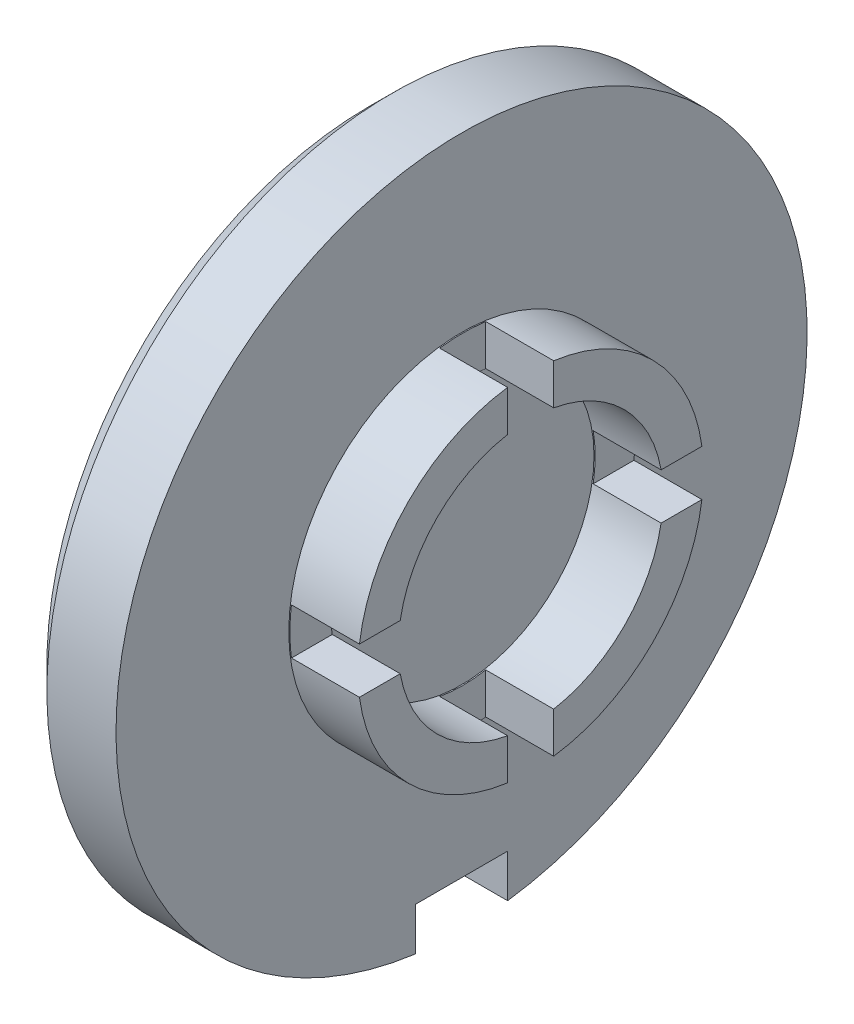
ISO-10303-21;
HEADER;
FILE_DESCRIPTION(('STEP AP214'),'2;1');
FILE_NAME('part.step','',(''),(''),'','','');
FILE_SCHEMA(('AUTOMOTIVE_DESIGN { 1 0 10303 214 1 1 1 1 }'));
ENDSEC;
DATA;
#1=APPLICATION_CONTEXT('core data for automotive mechanical design processes');
#2=APPLICATION_PROTOCOL_DEFINITION('international standard','automotive_design',2000,#1);
#3=PRODUCT_CONTEXT('',#1,'mechanical');
#4=PRODUCT('Part','Part','',(#3));
#5=PRODUCT_RELATED_PRODUCT_CATEGORY('part','',(#4));
#6=PRODUCT_DEFINITION_FORMATION('','',#4);
#7=PRODUCT_DEFINITION_CONTEXT('part definition',#1,'design');
#8=PRODUCT_DEFINITION('design','',#6,#7);
#9=PRODUCT_DEFINITION_SHAPE('','',#8);
#10=(LENGTH_UNIT() NAMED_UNIT(*) SI_UNIT(.MILLI.,.METRE.));
#11=(NAMED_UNIT(*) PLANE_ANGLE_UNIT() SI_UNIT($,.RADIAN.));
#12=(NAMED_UNIT(*) SI_UNIT($,.STERADIAN.) SOLID_ANGLE_UNIT());
#13=UNCERTAINTY_MEASURE_WITH_UNIT(LENGTH_MEASURE(1.E-05),#10,'distance_accuracy_value','');
#14=(GEOMETRIC_REPRESENTATION_CONTEXT(3) GLOBAL_UNCERTAINTY_ASSIGNED_CONTEXT((#13)) GLOBAL_UNIT_ASSIGNED_CONTEXT((#10,
#11,#12)) REPRESENTATION_CONTEXT('',''));
#15=CARTESIAN_POINT('',(0.,0.,0.));
#16=DIRECTION('',(0.,0.,1.));
#17=DIRECTION('',(1.,0.,0.));
#18=AXIS2_PLACEMENT_3D('',#15,#16,#17);
#19=CARTESIAN_POINT('',(-61.,18.,66.));
#20=DIRECTION('',(1.,0.,0.));
#21=DIRECTION('',(0.,0.,-1.));
#22=AXIS2_PLACEMENT_3D('',#19,#20,#21);
#23=PLANE('',#22);
#24=DIRECTION('',(0.,1.,0.));
#25=VECTOR('',#24,1.);
#26=CARTESIAN_POINT('',(-61.,18.,66.8));
#27=LINE('',#26,#25);
#28=CARTESIAN_POINT('',(-61.,12.4574374157796,66.8));
#29=VERTEX_POINT('',#28);
#30=CARTESIAN_POINT('',(-61.,12.8,66.8));
#31=VERTEX_POINT('',#30);
#32=EDGE_CURVE('E359',#29,#31,#27,.T.);
#33=ORIENTED_EDGE('',*,*,#32,.F.);
#34=CARTESIAN_POINT('',(-61.,18.,66.));
#35=DIRECTION('',(-1.,0.,0.));
#36=DIRECTION('',(0.,0.,1.));
#37=AXIS2_PLACEMENT_3D('',#34,#35,#36);
#38=CIRCLE('',#37,5.6);
#39=CARTESIAN_POINT('',(-61.,12.4574374157796,65.2));
#40=VERTEX_POINT('',#39);
#41=EDGE_CURVE('E260',#29,#40,#38,.T.);
#42=ORIENTED_EDGE('',*,*,#41,.T.);
#43=DIRECTION('',(0.,1.,0.));
#44=VECTOR('',#43,1.);
#45=CARTESIAN_POINT('',(-61.,18.,65.2));
#46=LINE('',#45,#44);
#47=CARTESIAN_POINT('',(-61.,12.8,65.2));
#48=VERTEX_POINT('',#47);
#49=EDGE_CURVE('E395',#40,#48,#46,.T.);
#50=ORIENTED_EDGE('',*,*,#49,.T.);
#51=DIRECTION('',(0.,0.,-1.));
#52=VECTOR('',#51,1.);
#53=CARTESIAN_POINT('',(-61.,12.8,66.));
#54=LINE('',#53,#52);
#55=EDGE_CURVE('E205',#31,#48,#54,.T.);
#56=ORIENTED_EDGE('',*,*,#55,.F.);
#57=EDGE_LOOP('',(#33,#42,#50,#56));
#58=FACE_BOUND('',#57,.T.);
#59=ADVANCED_FACE('F47',(#58),#23,.F.);
#60=CARTESIAN_POINT('',(-60.6,18.,66.));
#61=DIRECTION('',(1.,0.,0.));
#62=DIRECTION('',(0.,0.,-1.));
#63=AXIS2_PLACEMENT_3D('',#60,#61,#62);
#64=CONICAL_SURFACE('',#63,6.,0.785398163397448);
#65=CARTESIAN_POINT('',(-59.7053728090001,11.151943041791,66.8));
#66=CARTESIAN_POINT('',(-59.8881030317565,11.3359192533132,66.8));
#67=CARTESIAN_POINT('',(-60.0707866928955,11.5199417495671,66.8));
#68=CARTESIAN_POINT('',(-60.4360245862569,11.8881147982359,66.8));
#69=CARTESIAN_POINT('',(-60.6185788185969,12.0722653505341,66.8));
#70=CARTESIAN_POINT('',(-60.9835219670776,12.4407304192213,66.8));
#71=CARTESIAN_POINT('',(-61.1659108831408,12.625044935687,66.8));
#72=CARTESIAN_POINT('',(-61.5304582431577,12.9939020574378,66.8));
#73=CARTESIAN_POINT('',(-61.7126166868986,13.1784446629332,66.8));
#74=CARTESIAN_POINT('',(-61.8946271909999,13.3631332484449,66.8));
#75=B_SPLINE_CURVE_WITH_KNOTS('',3,(#65,#66,#67,#68,#69,#70,#71,#72,#73,#74),.UNSPECIFIED.,.F.,
.F.,(4,2,2,2,4),(0.,0.777906337908816,1.55581196755151,2.33371796179649,3.11162467374071),.UNSPECIFIED.);
#76=CARTESIAN_POINT('',(-60.6,12.0535725010726,66.8));
#77=VERTEX_POINT('',#76);
#78=EDGE_CURVE('E362',#77,#29,#75,.T.);
#79=ORIENTED_EDGE('',*,*,#78,.F.);
#80=CARTESIAN_POINT('',(-60.6,18.,66.));
#81=DIRECTION('',(-1.,0.,0.));
#82=DIRECTION('',(0.,0.,1.));
#83=AXIS2_PLACEMENT_3D('',#80,#81,#82);
#84=CIRCLE('',#83,6.);
#85=CARTESIAN_POINT('',(-60.6,12.0535725010726,65.2));
#86=VERTEX_POINT('',#85);
#87=EDGE_CURVE('E264',#77,#86,#84,.T.);
#88=ORIENTED_EDGE('',*,*,#87,.T.);
#89=CARTESIAN_POINT('',(-59.7053728090001,11.151943041791,65.2));
#90=CARTESIAN_POINT('',(-59.8881030317565,11.3359192533132,65.2));
#91=CARTESIAN_POINT('',(-60.0707866928955,11.5199417495671,65.2));
#92=CARTESIAN_POINT('',(-60.4360245862569,11.8881147982359,65.2));
#93=CARTESIAN_POINT('',(-60.6185788185969,12.0722653505341,65.2));
#94=CARTESIAN_POINT('',(-60.9835219670776,12.4407304192213,65.2));
#95=CARTESIAN_POINT('',(-61.1659108831408,12.625044935687,65.2));
#96=CARTESIAN_POINT('',(-61.5304582431577,12.9939020574378,65.2));
#97=CARTESIAN_POINT('',(-61.7126166868986,13.1784446629332,65.2));
#98=CARTESIAN_POINT('',(-61.8946271909999,13.3631332484449,65.2));
#99=B_SPLINE_CURVE_WITH_KNOTS('',3,(#89,#90,#91,#92,#93,#94,#95,#96,#97,#98),.UNSPECIFIED.,.F.,
.F.,(4,2,2,2,4),(0.,0.777906337908816,1.55581196755151,2.33371796179649,3.11162467374071),.UNSPECIFIED.);
#100=EDGE_CURVE('E387',#86,#40,#99,.T.);
#101=ORIENTED_EDGE('',*,*,#100,.T.);
#102=ORIENTED_EDGE('',*,*,#41,.F.);
#103=EDGE_LOOP('',(#79,#88,#101,#102));
#104=FACE_BOUND('',#103,.T.);
#105=ADVANCED_FACE('F373',(#104),#64,.T.);
#106=CARTESIAN_POINT('',(-66.,18.,66.));
#107=DIRECTION('',(-1.,0.,0.));
#108=DIRECTION('',(0.,0.,1.));
#109=AXIS2_PLACEMENT_3D('',#106,#107,#108);
#110=CYLINDRICAL_SURFACE('',#109,6.);
#111=DIRECTION('',(-1.,0.,0.));
#112=VECTOR('',#111,1.);
#113=CARTESIAN_POINT('',(-66.,12.0535725010726,66.8));
#114=LINE('',#113,#112);
#115=CARTESIAN_POINT('',(-59.4,12.0535725010726,66.8));
#116=VERTEX_POINT('',#115);
#117=EDGE_CURVE('E371',#116,#77,#114,.T.);
#118=ORIENTED_EDGE('',*,*,#117,.F.);
#119=CARTESIAN_POINT('',(-59.4,18.,66.));
#120=DIRECTION('',(-1.,0.,0.));
#121=DIRECTION('',(0.,0.,1.));
#122=AXIS2_PLACEMENT_3D('',#119,#120,#121);
#123=CIRCLE('',#122,6.);
#124=CARTESIAN_POINT('',(-59.4,12.0535725010726,65.2));
#125=VERTEX_POINT('',#124);
#126=EDGE_CURVE('E268',#116,#125,#123,.T.);
#127=ORIENTED_EDGE('',*,*,#126,.T.);
#128=DIRECTION('',(-1.,0.,0.));
#129=VECTOR('',#128,1.);
#130=CARTESIAN_POINT('',(-66.,12.0535725010726,65.2));
#131=LINE('',#130,#129);
#132=EDGE_CURVE('E63',#125,#86,#131,.T.);
#133=ORIENTED_EDGE('',*,*,#132,.T.);
#134=ORIENTED_EDGE('',*,*,#87,.F.);
#135=EDGE_LOOP('',(#118,#127,#133,#134));
#136=FACE_BOUND('',#135,.T.);
#137=ADVANCED_FACE('F406',(#136),#110,.T.);
#138=CARTESIAN_POINT('',(-59.4,24.,66.));
#139=DIRECTION('',(-1.,0.,0.));
#140=DIRECTION('',(0.,0.,1.));
#141=AXIS2_PLACEMENT_3D('',#138,#139,#140);
#142=PLANE('',#141);
#143=CARTESIAN_POINT('',(-59.4,18.,66.));
#144=DIRECTION('',(-1.,0.,0.));
#145=DIRECTION('',(0.,0.,1.));
#146=AXIS2_PLACEMENT_3D('',#143,#144,#145);
#147=CIRCLE('',#146,3.);
#148=CARTESIAN_POINT('',(-59.4,18.,69.));
#149=VERTEX_POINT('',#148);
#150=EDGE_CURVE('E271',#149,#149,#147,.T.);
#151=ORIENTED_EDGE('',*,*,#150,.T.);
#152=EDGE_LOOP('',(#151));
#153=FACE_BOUND('',#152,.T.);
#154=DIRECTION('',(0.,-1.,0.));
#155=VECTOR('',#154,1.);
#156=CARTESIAN_POINT('',(-59.4,24.,66.8));
#157=LINE('',#156,#155);
#158=CARTESIAN_POINT('',(-59.4,12.8,66.8));
#159=VERTEX_POINT('',#158);
#160=EDGE_CURVE('E11',#159,#116,#157,.T.);
#161=ORIENTED_EDGE('',*,*,#160,.F.);
#162=DIRECTION('',(0.,0.,1.));
#163=VECTOR('',#162,1.);
#164=CARTESIAN_POINT('',(-59.4,12.8,66.));
#165=LINE('',#164,#163);
#166=CARTESIAN_POINT('',(-59.4,12.8,65.2));
#167=VERTEX_POINT('',#166);
#168=EDGE_CURVE('E56',#167,#159,#165,.T.);
#169=ORIENTED_EDGE('',*,*,#168,.F.);
#170=DIRECTION('',(0.,-1.,0.));
#171=VECTOR('',#170,1.);
#172=CARTESIAN_POINT('',(-59.4,24.,65.2));
#173=LINE('',#172,#171);
#174=EDGE_CURVE('E188',#167,#125,#173,.T.);
#175=ORIENTED_EDGE('',*,*,#174,.T.);
#176=ORIENTED_EDGE('',*,*,#126,.F.);
#177=EDGE_LOOP('',(#161,#169,#175,#176));
#178=FACE_BOUND('',#177,.T.);
#179=ADVANCED_FACE('F210',(#153,#178),#142,.F.);
#180=CARTESIAN_POINT('',(-58.2,21.,66.));
#181=DIRECTION('',(-1.,0.,0.));
#182=DIRECTION('',(0.,0.,1.));
#183=AXIS2_PLACEMENT_3D('',#180,#181,#182);
#184=PLANE('',#183);
#185=DIRECTION('',(0.,-1.,0.));
#186=VECTOR('',#185,1.);
#187=CARTESIAN_POINT('',(-58.2,21.,66.4));
#188=LINE('',#187,#186);
#189=CARTESIAN_POINT('',(-58.2,15.7350496694188,66.4));
#190=VERTEX_POINT('',#189);
#191=CARTESIAN_POINT('',(-58.2,15.0267862505363,66.4));
#192=VERTEX_POINT('',#191);
#193=EDGE_CURVE('E324',#190,#192,#188,.T.);
#194=ORIENTED_EDGE('',*,*,#193,.F.);
#195=CARTESIAN_POINT('',(-58.2,18.,66.));
#196=DIRECTION('',(-1.,0.,0.));
#197=DIRECTION('',(0.,0.,1.));
#198=AXIS2_PLACEMENT_3D('',#195,#196,#197);
#199=CIRCLE('',#198,2.3);
#200=CARTESIAN_POINT('',(-58.2,17.6,68.2649503305812));
#201=VERTEX_POINT('',#200);
#202=EDGE_CURVE('E259',#190,#201,#199,.T.);
#203=ORIENTED_EDGE('',*,*,#202,.T.);
#204=DIRECTION('',(0.,0.,-1.));
#205=VECTOR('',#204,1.);
#206=CARTESIAN_POINT('',(-58.2,17.6,66.));
#207=LINE('',#206,#205);
#208=CARTESIAN_POINT('',(-58.2,17.6,68.9732137494637));
#209=VERTEX_POINT('',#208);
#210=EDGE_CURVE('E293',#209,#201,#207,.T.);
#211=ORIENTED_EDGE('',*,*,#210,.F.);
#212=CARTESIAN_POINT('',(-58.2,18.,66.));
#213=DIRECTION('',(-1.,0.,0.));
#214=DIRECTION('',(0.,0.,1.));
#215=AXIS2_PLACEMENT_3D('',#212,#213,#214);
#216=CIRCLE('',#215,3.);
#217=EDGE_CURVE('E280',#192,#209,#216,.T.);
#218=ORIENTED_EDGE('',*,*,#217,.F.);
#219=EDGE_LOOP('',(#194,#203,#211,#218));
#220=FACE_BOUND('',#219,.T.);
#221=ADVANCED_FACE('F431',(#220),#184,.F.);
#222=DIRECTION('',(0.,-1.,0.));
#223=VECTOR('',#222,1.);
#224=CARTESIAN_POINT('',(-58.2,21.,66.4));
#225=LINE('',#224,#223);
#226=CARTESIAN_POINT('',(-58.2,20.9732137494637,66.4));
#227=VERTEX_POINT('',#226);
#228=CARTESIAN_POINT('',(-58.2,20.2649503305812,66.4));
#229=VERTEX_POINT('',#228);
#230=EDGE_CURVE('E330',#227,#229,#225,.T.);
#231=ORIENTED_EDGE('',*,*,#230,.F.);
#232=CARTESIAN_POINT('',(-58.2,18.4,68.9732137494637));
#233=VERTEX_POINT('',#232);
#234=EDGE_CURVE('E275',#233,#227,#216,.T.);
#235=ORIENTED_EDGE('',*,*,#234,.F.);
#236=DIRECTION('',(0.,0.,1.));
#237=VECTOR('',#236,1.);
#238=CARTESIAN_POINT('',(-58.2,18.4,66.));
#239=LINE('',#238,#237);
#240=CARTESIAN_POINT('',(-58.2,18.4,68.2649503305812));
#241=VERTEX_POINT('',#240);
#242=EDGE_CURVE('E300',#241,#233,#239,.T.);
#243=ORIENTED_EDGE('',*,*,#242,.F.);
#244=EDGE_CURVE('E249',#241,#229,#199,.T.);
#245=ORIENTED_EDGE('',*,*,#244,.T.);
#246=EDGE_LOOP('',(#231,#235,#243,#245));
#247=FACE_BOUND('',#246,.T.);
#248=ADVANCED_FACE('F423',(#247),#184,.F.);
#249=CARTESIAN_POINT('',(-66.,18.,66.));
#250=DIRECTION('',(-1.,0.,0.));
#251=DIRECTION('',(0.,0.,1.));
#252=AXIS2_PLACEMENT_3D('',#249,#250,#251);
#253=CYLINDRICAL_SURFACE('',#252,2.3);
#254=CARTESIAN_POINT('',(-59.4,18.,66.));
#255=DIRECTION('',(-1.,0.,0.));
#256=DIRECTION('',(0.,0.,1.));
#257=AXIS2_PLACEMENT_3D('',#254,#255,#256);
#258=CIRCLE('',#257,2.3);
#259=CARTESIAN_POINT('',(-59.4,18.,68.3));
#260=VERTEX_POINT('',#259);
#261=EDGE_CURVE('E255',#260,#260,#258,.T.);
#262=ORIENTED_EDGE('',*,*,#261,.T.);
#263=EDGE_LOOP('',(#262));
#264=FACE_BOUND('',#263,.T.);
#265=DIRECTION('',(-1.,0.,0.));
#266=VECTOR('',#265,1.);
#267=CARTESIAN_POINT('',(-66.,15.7350496694188,66.4));
#268=LINE('',#267,#266);
#269=CARTESIAN_POINT('',(-59.38,15.7350496694188,66.4));
#270=VERTEX_POINT('',#269);
#271=EDGE_CURVE('E321',#270,#190,#268,.F.);
#272=ORIENTED_EDGE('',*,*,#271,.F.);
#273=CARTESIAN_POINT('',(-59.38,18.,66.));
#274=DIRECTION('',(1.,0.,0.));
#275=DIRECTION('',(0.,0.,-1.));
#276=AXIS2_PLACEMENT_3D('',#273,#274,#275);
#277=CIRCLE('',#276,2.3);
#278=CARTESIAN_POINT('',(-59.38,15.7350496694188,65.6));
#279=VERTEX_POINT('',#278);
#280=EDGE_CURVE('E317',#279,#270,#277,.F.);
#281=ORIENTED_EDGE('',*,*,#280,.F.);
#282=DIRECTION('',(-1.,0.,0.));
#283=VECTOR('',#282,1.);
#284=CARTESIAN_POINT('',(-66.,15.7350496694188,65.6));
#285=LINE('',#284,#283);
#286=CARTESIAN_POINT('',(-58.2,15.7350496694188,65.6));
#287=VERTEX_POINT('',#286);
#288=EDGE_CURVE('E333',#279,#287,#285,.F.);
#289=ORIENTED_EDGE('',*,*,#288,.T.);
#290=CARTESIAN_POINT('',(-58.2,17.6,63.7350496694188));
#291=VERTEX_POINT('',#290);
#292=EDGE_CURVE('E254',#291,#287,#199,.T.);
#293=ORIENTED_EDGE('',*,*,#292,.F.);
#294=DIRECTION('',(-1.,0.,0.));
#295=VECTOR('',#294,1.);
#296=CARTESIAN_POINT('',(-66.,17.6,63.7350496694188));
#297=LINE('',#296,#295);
#298=CARTESIAN_POINT('',(-59.38,17.6,63.7350496694188));
#299=VERTEX_POINT('',#298);
#300=EDGE_CURVE('E286',#299,#291,#297,.F.);
#301=ORIENTED_EDGE('',*,*,#300,.F.);
#302=CARTESIAN_POINT('',(-59.38,18.,66.));
#303=DIRECTION('',(1.,0.,0.));
#304=DIRECTION('',(0.,0.,-1.));
#305=AXIS2_PLACEMENT_3D('',#302,#303,#304);
#306=CIRCLE('',#305,2.3);
#307=CARTESIAN_POINT('',(-59.38,18.4,63.7350496694188));
#308=VERTEX_POINT('',#307);
#309=EDGE_CURVE('E282',#308,#299,#306,.F.);
#310=ORIENTED_EDGE('',*,*,#309,.F.);
#311=DIRECTION('',(-1.,0.,0.));
#312=VECTOR('',#311,1.);
#313=CARTESIAN_POINT('',(-66.,18.4,63.7350496694188));
#314=LINE('',#313,#312);
#315=CARTESIAN_POINT('',(-58.2,18.4,63.7350496694188));
#316=VERTEX_POINT('',#315);
#317=EDGE_CURVE('E301',#316,#308,#314,.T.);
#318=ORIENTED_EDGE('',*,*,#317,.F.);
#319=CARTESIAN_POINT('',(-58.2,20.2649503305812,65.6));
#320=VERTEX_POINT('',#319);
#321=EDGE_CURVE('E253',#320,#316,#199,.T.);
#322=ORIENTED_EDGE('',*,*,#321,.F.);
#323=DIRECTION('',(-1.,0.,0.));
#324=VECTOR('',#323,1.);
#325=CARTESIAN_POINT('',(-66.,20.2649503305812,65.6));
#326=LINE('',#325,#324);
#327=CARTESIAN_POINT('',(-59.38,20.2649503305812,65.6));
#328=VERTEX_POINT('',#327);
#329=EDGE_CURVE('E341',#320,#328,#326,.T.);
#330=ORIENTED_EDGE('',*,*,#329,.T.);
#331=CARTESIAN_POINT('',(-59.38,20.2649503305812,66.4));
#332=VERTEX_POINT('',#331);
#333=EDGE_CURVE('E318',#332,#328,#277,.F.);
#334=ORIENTED_EDGE('',*,*,#333,.F.);
#335=DIRECTION('',(-1.,0.,0.));
#336=VECTOR('',#335,1.);
#337=CARTESIAN_POINT('',(-66.,20.2649503305812,66.4));
#338=LINE('',#337,#336);
#339=EDGE_CURVE('E327',#229,#332,#338,.T.);
#340=ORIENTED_EDGE('',*,*,#339,.F.);
#341=ORIENTED_EDGE('',*,*,#244,.F.);
#342=DIRECTION('',(-1.,0.,0.));
#343=VECTOR('',#342,1.);
#344=CARTESIAN_POINT('',(-66.,18.4,68.2649503305812));
#345=LINE('',#344,#343);
#346=CARTESIAN_POINT('',(-59.38,18.4,68.2649503305812));
#347=VERTEX_POINT('',#346);
#348=EDGE_CURVE('E297',#347,#241,#345,.F.);
#349=ORIENTED_EDGE('',*,*,#348,.F.);
#350=CARTESIAN_POINT('',(-59.38,17.6,68.2649503305812));
#351=VERTEX_POINT('',#350);
#352=EDGE_CURVE('E285',#351,#347,#306,.F.);
#353=ORIENTED_EDGE('',*,*,#352,.F.);
#354=DIRECTION('',(-1.,0.,0.));
#355=VECTOR('',#354,1.);
#356=CARTESIAN_POINT('',(-66.,17.6,68.2649503305812));
#357=LINE('',#356,#355);
#358=EDGE_CURVE('E290',#201,#351,#357,.T.);
#359=ORIENTED_EDGE('',*,*,#358,.F.);
#360=ORIENTED_EDGE('',*,*,#202,.F.);
#361=EDGE_LOOP('',(#272,#281,#289,#293,#301,#310,#318,#322,#330,#334,#340,#341,#349,#353,#359,#360));
#362=FACE_BOUND('',#361,.T.);
#363=ADVANCED_FACE('F420',(#264,#362),#253,.F.);
#364=CARTESIAN_POINT('',(-66.,18.,66.));
#365=DIRECTION('',(-1.,0.,0.));
#366=DIRECTION('',(0.,0.,1.));
#367=AXIS2_PLACEMENT_3D('',#364,#365,#366);
#368=CYLINDRICAL_SURFACE('',#367,3.);
#369=ORIENTED_EDGE('',*,*,#150,.F.);
#370=EDGE_LOOP('',(#369));
#371=FACE_BOUND('',#370,.T.);
#372=DIRECTION('',(-1.,0.,0.));
#373=VECTOR('',#372,1.);
#374=CARTESIAN_POINT('',(-66.,15.0267862505363,66.4));
#375=LINE('',#374,#373);
#376=CARTESIAN_POINT('',(-59.38,15.0267862505363,66.4));
#377=VERTEX_POINT('',#376);
#378=EDGE_CURVE('E198',#192,#377,#375,.T.);
#379=ORIENTED_EDGE('',*,*,#378,.F.);
#380=ORIENTED_EDGE('',*,*,#217,.T.);
#381=DIRECTION('',(-1.,0.,0.));
#382=VECTOR('',#381,1.);
#383=CARTESIAN_POINT('',(-66.,17.6,68.9732137494637));
#384=LINE('',#383,#382);
#385=CARTESIAN_POINT('',(-59.38,17.6,68.9732137494637));
#386=VERTEX_POINT('',#385);
#387=EDGE_CURVE('E230',#386,#209,#384,.F.);
#388=ORIENTED_EDGE('',*,*,#387,.F.);
#389=CARTESIAN_POINT('',(-59.38,18.,66.));
#390=DIRECTION('',(1.,0.,0.));
#391=DIRECTION('',(0.,0.,-1.));
#392=AXIS2_PLACEMENT_3D('',#389,#390,#391);
#393=CIRCLE('',#392,3.);
#394=CARTESIAN_POINT('',(-59.38,18.4,68.9732137494637));
#395=VERTEX_POINT('',#394);
#396=EDGE_CURVE('E234',#395,#386,#393,.T.);
#397=ORIENTED_EDGE('',*,*,#396,.F.);
#398=DIRECTION('',(-1.,0.,0.));
#399=VECTOR('',#398,1.);
#400=CARTESIAN_POINT('',(-66.,18.4,68.9732137494637));
#401=LINE('',#400,#399);
#402=EDGE_CURVE('E235',#233,#395,#401,.T.);
#403=ORIENTED_EDGE('',*,*,#402,.F.);
#404=ORIENTED_EDGE('',*,*,#234,.T.);
#405=DIRECTION('',(-1.,0.,0.));
#406=VECTOR('',#405,1.);
#407=CARTESIAN_POINT('',(-66.,20.9732137494637,66.4));
#408=LINE('',#407,#406);
#409=CARTESIAN_POINT('',(-59.38,20.9732137494637,66.4));
#410=VERTEX_POINT('',#409);
#411=EDGE_CURVE('E220',#410,#227,#408,.F.);
#412=ORIENTED_EDGE('',*,*,#411,.F.);
#413=CARTESIAN_POINT('',(-59.38,18.,66.));
#414=DIRECTION('',(1.,0.,0.));
#415=DIRECTION('',(0.,0.,-1.));
#416=AXIS2_PLACEMENT_3D('',#413,#414,#415);
#417=CIRCLE('',#416,3.);
#418=CARTESIAN_POINT('',(-59.38,20.9732137494637,65.6));
#419=VERTEX_POINT('',#418);
#420=EDGE_CURVE('E223',#419,#410,#417,.T.);
#421=ORIENTED_EDGE('',*,*,#420,.F.);
#422=DIRECTION('',(-1.,0.,0.));
#423=VECTOR('',#422,1.);
#424=CARTESIAN_POINT('',(-66.,20.9732137494637,65.6));
#425=LINE('',#424,#423);
#426=CARTESIAN_POINT('',(-58.2,20.9732137494637,65.6));
#427=VERTEX_POINT('',#426);
#428=EDGE_CURVE('E226',#419,#427,#425,.F.);
#429=ORIENTED_EDGE('',*,*,#428,.T.);
#430=CARTESIAN_POINT('',(-58.2,18.4,63.0267862505363));
#431=VERTEX_POINT('',#430);
#432=EDGE_CURVE('E279',#427,#431,#216,.T.);
#433=ORIENTED_EDGE('',*,*,#432,.T.);
#434=DIRECTION('',(-1.,0.,0.));
#435=VECTOR('',#434,1.);
#436=CARTESIAN_POINT('',(-66.,18.4,63.0267862505363));
#437=LINE('',#436,#435);
#438=CARTESIAN_POINT('',(-59.38,18.4,63.0267862505363));
#439=VERTEX_POINT('',#438);
#440=EDGE_CURVE('E245',#439,#431,#437,.F.);
#441=ORIENTED_EDGE('',*,*,#440,.F.);
#442=CARTESIAN_POINT('',(-59.38,17.6,63.0267862505363));
#443=VERTEX_POINT('',#442);
#444=EDGE_CURVE('E241',#443,#439,#393,.T.);
#445=ORIENTED_EDGE('',*,*,#444,.F.);
#446=DIRECTION('',(-1.,0.,0.));
#447=VECTOR('',#446,1.);
#448=CARTESIAN_POINT('',(-66.,17.6,63.0267862505363));
#449=LINE('',#448,#447);
#450=CARTESIAN_POINT('',(-58.2,17.6,63.0267862505363));
#451=VERTEX_POINT('',#450);
#452=EDGE_CURVE('E238',#451,#443,#449,.T.);
#453=ORIENTED_EDGE('',*,*,#452,.F.);
#454=CARTESIAN_POINT('',(-58.2,15.0267862505363,65.6));
#455=VERTEX_POINT('',#454);
#456=EDGE_CURVE('E281',#451,#455,#216,.T.);
#457=ORIENTED_EDGE('',*,*,#456,.T.);
#458=DIRECTION('',(-1.,0.,0.));
#459=VECTOR('',#458,1.);
#460=CARTESIAN_POINT('',(-66.,15.0267862505363,65.6));
#461=LINE('',#460,#459);
#462=CARTESIAN_POINT('',(-59.38,15.0267862505363,65.6));
#463=VERTEX_POINT('',#462);
#464=EDGE_CURVE('E216',#455,#463,#461,.T.);
#465=ORIENTED_EDGE('',*,*,#464,.T.);
#466=EDGE_CURVE('E215',#377,#463,#417,.T.);
#467=ORIENTED_EDGE('',*,*,#466,.F.);
#468=EDGE_LOOP('',(#379,#380,#388,#397,#403,#404,#412,#421,#429,#433,#441,#445,#453,#457,#465,#467));
#469=FACE_BOUND('',#468,.T.);
#470=ADVANCED_FACE('F422',(#371,#469),#368,.T.);
#471=ORIENTED_EDGE('',*,*,#292,.T.);
#472=DIRECTION('',(0.,-1.,0.));
#473=VECTOR('',#472,1.);
#474=CARTESIAN_POINT('',(-58.2,21.,65.6));
#475=LINE('',#474,#473);
#476=EDGE_CURVE('E337',#287,#455,#475,.T.);
#477=ORIENTED_EDGE('',*,*,#476,.T.);
#478=ORIENTED_EDGE('',*,*,#456,.F.);
#479=EDGE_CURVE('E289',#291,#451,#207,.T.);
#480=ORIENTED_EDGE('',*,*,#479,.F.);
#481=EDGE_LOOP('',(#471,#477,#478,#480));
#482=FACE_BOUND('',#481,.T.);
#483=ADVANCED_FACE('F49',(#482),#184,.F.);
#484=ORIENTED_EDGE('',*,*,#432,.F.);
#485=DIRECTION('',(0.,-1.,0.));
#486=VECTOR('',#485,1.);
#487=CARTESIAN_POINT('',(-58.2,21.,65.6));
#488=LINE('',#487,#486);
#489=EDGE_CURVE('E345',#427,#320,#488,.T.);
#490=ORIENTED_EDGE('',*,*,#489,.T.);
#491=ORIENTED_EDGE('',*,*,#321,.T.);
#492=EDGE_CURVE('E304',#431,#316,#239,.T.);
#493=ORIENTED_EDGE('',*,*,#492,.F.);
#494=EDGE_LOOP('',(#484,#490,#491,#493));
#495=FACE_BOUND('',#494,.T.);
#496=ADVANCED_FACE('F418',(#495),#184,.F.);
#497=CARTESIAN_POINT('',(-59.4,20.3,66.));
#498=DIRECTION('',(-1.,0.,0.));
#499=DIRECTION('',(0.,0.,1.));
#500=AXIS2_PLACEMENT_3D('',#497,#498,#499);
#501=PLANE('',#500);
#502=ORIENTED_EDGE('',*,*,#261,.F.);
#503=EDGE_LOOP('',(#502));
#504=FACE_BOUND('',#503,.T.);
#505=ADVANCED_FACE('F415',(#504),#501,.F.);
#506=CARTESIAN_POINT('',(-59.38,17.6,69.2));
#507=DIRECTION('',(0.,1.,0.));
#508=DIRECTION('',(0.,0.,1.));
#509=AXIS2_PLACEMENT_3D('',#506,#507,#508);
#510=PLANE('',#509);
#511=ORIENTED_EDGE('',*,*,#300,.T.);
#512=ORIENTED_EDGE('',*,*,#479,.T.);
#513=ORIENTED_EDGE('',*,*,#452,.T.);
#514=DIRECTION('',(0.,0.,-1.));
#515=VECTOR('',#514,1.);
#516=CARTESIAN_POINT('',(-59.38,17.6,69.2));
#517=LINE('',#516,#515);
#518=EDGE_CURVE('E309',#299,#443,#517,.T.);
#519=ORIENTED_EDGE('',*,*,#518,.F.);
#520=EDGE_LOOP('',(#511,#512,#513,#519));
#521=FACE_BOUND('',#520,.T.);
#522=ADVANCED_FACE('F417',(#521),#510,.T.);
#523=CARTESIAN_POINT('',(-59.38,18.4,69.2));
#524=DIRECTION('',(0.,-1.,0.));
#525=DIRECTION('',(0.,0.,-1.));
#526=AXIS2_PLACEMENT_3D('',#523,#524,#525);
#527=PLANE('',#526);
#528=ORIENTED_EDGE('',*,*,#317,.T.);
#529=DIRECTION('',(0.,0.,-1.));
#530=VECTOR('',#529,1.);
#531=CARTESIAN_POINT('',(-59.38,18.4,69.2));
#532=LINE('',#531,#530);
#533=EDGE_CURVE('E314',#308,#439,#532,.T.);
#534=ORIENTED_EDGE('',*,*,#533,.T.);
#535=ORIENTED_EDGE('',*,*,#440,.T.);
#536=ORIENTED_EDGE('',*,*,#492,.T.);
#537=EDGE_LOOP('',(#528,#534,#535,#536));
#538=FACE_BOUND('',#537,.T.);
#539=ADVANCED_FACE('F461',(#538),#527,.T.);
#540=CARTESIAN_POINT('',(-59.38,17.6,69.2));
#541=DIRECTION('',(1.,0.,0.));
#542=DIRECTION('',(0.,0.,-1.));
#543=AXIS2_PLACEMENT_3D('',#540,#541,#542);
#544=PLANE('',#543);
#545=ORIENTED_EDGE('',*,*,#309,.T.);
#546=ORIENTED_EDGE('',*,*,#518,.T.);
#547=ORIENTED_EDGE('',*,*,#444,.T.);
#548=ORIENTED_EDGE('',*,*,#533,.F.);
#549=EDGE_LOOP('',(#545,#546,#547,#548));
#550=FACE_BOUND('',#549,.T.);
#551=ADVANCED_FACE('F484',(#550),#544,.T.);
#552=ORIENTED_EDGE('',*,*,#352,.T.);
#553=EDGE_CURVE('E313',#395,#347,#532,.T.);
#554=ORIENTED_EDGE('',*,*,#553,.F.);
#555=ORIENTED_EDGE('',*,*,#396,.T.);
#556=EDGE_CURVE('E308',#386,#351,#517,.T.);
#557=ORIENTED_EDGE('',*,*,#556,.T.);
#558=EDGE_LOOP('',(#552,#554,#555,#557));
#559=FACE_BOUND('',#558,.T.);
#560=ADVANCED_FACE('F486',(#559),#544,.T.);
#561=ORIENTED_EDGE('',*,*,#358,.T.);
#562=ORIENTED_EDGE('',*,*,#556,.F.);
#563=ORIENTED_EDGE('',*,*,#387,.T.);
#564=ORIENTED_EDGE('',*,*,#210,.T.);
#565=EDGE_LOOP('',(#561,#562,#563,#564));
#566=FACE_BOUND('',#565,.T.);
#567=ADVANCED_FACE('F491',(#566),#510,.T.);
#568=ORIENTED_EDGE('',*,*,#348,.T.);
#569=ORIENTED_EDGE('',*,*,#242,.T.);
#570=ORIENTED_EDGE('',*,*,#402,.T.);
#571=ORIENTED_EDGE('',*,*,#553,.T.);
#572=EDGE_LOOP('',(#568,#569,#570,#571));
#573=FACE_BOUND('',#572,.T.);
#574=ADVANCED_FACE('F495',(#573),#527,.T.);
#575=CARTESIAN_POINT('',(0.,0.,65.6));
#576=DIRECTION('',(0.,0.,-1.));
#577=DIRECTION('',(-1.,0.,0.));
#578=AXIS2_PLACEMENT_3D('',#575,#576,#577);
#579=PLANE('',#578);
#580=ORIENTED_EDGE('',*,*,#489,.F.);
#581=ORIENTED_EDGE('',*,*,#428,.F.);
#582=DIRECTION('',(0.,-1.,0.));
#583=VECTOR('',#582,1.);
#584=CARTESIAN_POINT('',(-59.38,14.8,65.6));
#585=LINE('',#584,#583);
#586=EDGE_CURVE('E352',#419,#328,#585,.T.);
#587=ORIENTED_EDGE('',*,*,#586,.T.);
#588=ORIENTED_EDGE('',*,*,#329,.F.);
#589=EDGE_LOOP('',(#580,#581,#587,#588));
#590=FACE_BOUND('',#589,.T.);
#591=ADVANCED_FACE('F573',(#590),#579,.F.);
#592=CARTESIAN_POINT('',(0.,0.,66.4));
#593=DIRECTION('',(0.,0.,-1.));
#594=DIRECTION('',(-1.,0.,0.));
#595=AXIS2_PLACEMENT_3D('',#592,#593,#594);
#596=PLANE('',#595);
#597=ORIENTED_EDGE('',*,*,#339,.T.);
#598=DIRECTION('',(0.,-1.,0.));
#599=VECTOR('',#598,1.);
#600=CARTESIAN_POINT('',(-59.38,14.8,66.4));
#601=LINE('',#600,#599);
#602=EDGE_CURVE('E349',#410,#332,#601,.T.);
#603=ORIENTED_EDGE('',*,*,#602,.F.);
#604=ORIENTED_EDGE('',*,*,#411,.T.);
#605=ORIENTED_EDGE('',*,*,#230,.T.);
#606=EDGE_LOOP('',(#597,#603,#604,#605));
#607=FACE_BOUND('',#606,.T.);
#608=ADVANCED_FACE('F591',(#607),#596,.T.);
#609=CARTESIAN_POINT('',(-59.38,14.8,66.4));
#610=DIRECTION('',(1.,0.,0.));
#611=DIRECTION('',(0.,0.,-1.));
#612=AXIS2_PLACEMENT_3D('',#609,#610,#611);
#613=PLANE('',#612);
#614=ORIENTED_EDGE('',*,*,#333,.T.);
#615=ORIENTED_EDGE('',*,*,#586,.F.);
#616=ORIENTED_EDGE('',*,*,#420,.T.);
#617=ORIENTED_EDGE('',*,*,#602,.T.);
#618=EDGE_LOOP('',(#614,#615,#616,#617));
#619=FACE_BOUND('',#618,.T.);
#620=ADVANCED_FACE('F600',(#619),#613,.T.);
#621=ORIENTED_EDGE('',*,*,#280,.T.);
#622=EDGE_CURVE('E353',#270,#377,#601,.T.);
#623=ORIENTED_EDGE('',*,*,#622,.T.);
#624=ORIENTED_EDGE('',*,*,#466,.T.);
#625=EDGE_CURVE('E71',#279,#463,#585,.T.);
#626=ORIENTED_EDGE('',*,*,#625,.F.);
#627=EDGE_LOOP('',(#621,#623,#624,#626));
#628=FACE_BOUND('',#627,.T.);
#629=ADVANCED_FACE('F477',(#628),#613,.T.);
#630=ORIENTED_EDGE('',*,*,#271,.T.);
#631=ORIENTED_EDGE('',*,*,#193,.T.);
#632=ORIENTED_EDGE('',*,*,#378,.T.);
#633=ORIENTED_EDGE('',*,*,#622,.F.);
#634=EDGE_LOOP('',(#630,#631,#632,#633));
#635=FACE_BOUND('',#634,.T.);
#636=ADVANCED_FACE('F442',(#635),#596,.T.);
#637=ORIENTED_EDGE('',*,*,#625,.T.);
#638=ORIENTED_EDGE('',*,*,#464,.F.);
#639=ORIENTED_EDGE('',*,*,#476,.F.);
#640=ORIENTED_EDGE('',*,*,#288,.F.);
#641=EDGE_LOOP('',(#637,#638,#639,#640));
#642=FACE_BOUND('',#641,.T.);
#643=ADVANCED_FACE('F475',(#642),#579,.F.);
#644=CARTESIAN_POINT('',(-61.1,12.8,66.8));
#645=DIRECTION('',(0.,-1.,0.));
#646=DIRECTION('',(0.,0.,-1.));
#647=AXIS2_PLACEMENT_3D('',#644,#645,#646);
#648=PLANE('',#647);
#649=ORIENTED_EDGE('',*,*,#55,.T.);
#650=DIRECTION('',(-1.,0.,0.));
#651=VECTOR('',#650,1.);
#652=CARTESIAN_POINT('',(-61.1,12.8,65.2));
#653=LINE('',#652,#651);
#654=EDGE_CURVE('E191',#167,#48,#653,.T.);
#655=ORIENTED_EDGE('',*,*,#654,.F.);
#656=ORIENTED_EDGE('',*,*,#168,.T.);
#657=DIRECTION('',(-1.,0.,0.));
#658=VECTOR('',#657,1.);
#659=CARTESIAN_POINT('',(-61.1,12.8,66.8));
#660=LINE('',#659,#658);
#661=EDGE_CURVE('E207',#159,#31,#660,.T.);
#662=ORIENTED_EDGE('',*,*,#661,.T.);
#663=EDGE_LOOP('',(#649,#655,#656,#662));
#664=FACE_BOUND('',#663,.T.);
#665=ADVANCED_FACE('F201',(#664),#648,.T.);
#666=CARTESIAN_POINT('',(0.,0.,66.8));
#667=DIRECTION('',(0.,0.,-1.));
#668=DIRECTION('',(-1.,0.,0.));
#669=AXIS2_PLACEMENT_3D('',#666,#667,#668);
#670=PLANE('',#669);
#671=ORIENTED_EDGE('',*,*,#32,.T.);
#672=ORIENTED_EDGE('',*,*,#661,.F.);
#673=ORIENTED_EDGE('',*,*,#160,.T.);
#674=ORIENTED_EDGE('',*,*,#117,.T.);
#675=ORIENTED_EDGE('',*,*,#78,.T.);
#676=EDGE_LOOP('',(#671,#672,#673,#674,#675));
#677=FACE_BOUND('',#676,.T.);
#678=ADVANCED_FACE('F377',(#677),#670,.T.);
#679=CARTESIAN_POINT('',(0.,0.,65.2));
#680=DIRECTION('',(0.,0.,-1.));
#681=DIRECTION('',(-1.,0.,0.));
#682=AXIS2_PLACEMENT_3D('',#679,#680,#681);
#683=PLANE('',#682);
#684=ORIENTED_EDGE('',*,*,#100,.F.);
#685=ORIENTED_EDGE('',*,*,#132,.F.);
#686=ORIENTED_EDGE('',*,*,#174,.F.);
#687=ORIENTED_EDGE('',*,*,#654,.T.);
#688=ORIENTED_EDGE('',*,*,#49,.F.);
#689=EDGE_LOOP('',(#684,#685,#686,#687,#688));
#690=FACE_BOUND('',#689,.T.);
#691=ADVANCED_FACE('F190',(#690),#683,.F.);
#692=CLOSED_SHELL('',(#59,#105,#137,#179,#221,#248,#363,#470,#483,#496,#505,#522,#539,#551,#560,
#567,#574,#591,#608,#620,#629,#636,#643,#665,#678,#691));
#693=MANIFOLD_SOLID_BREP('B2',#692);
#694=ADVANCED_BREP_SHAPE_REPRESENTATION('',(#18,#693),#14);
#695=SHAPE_DEFINITION_REPRESENTATION(#9,#694);
ENDSEC;
END-ISO-10303-21;
